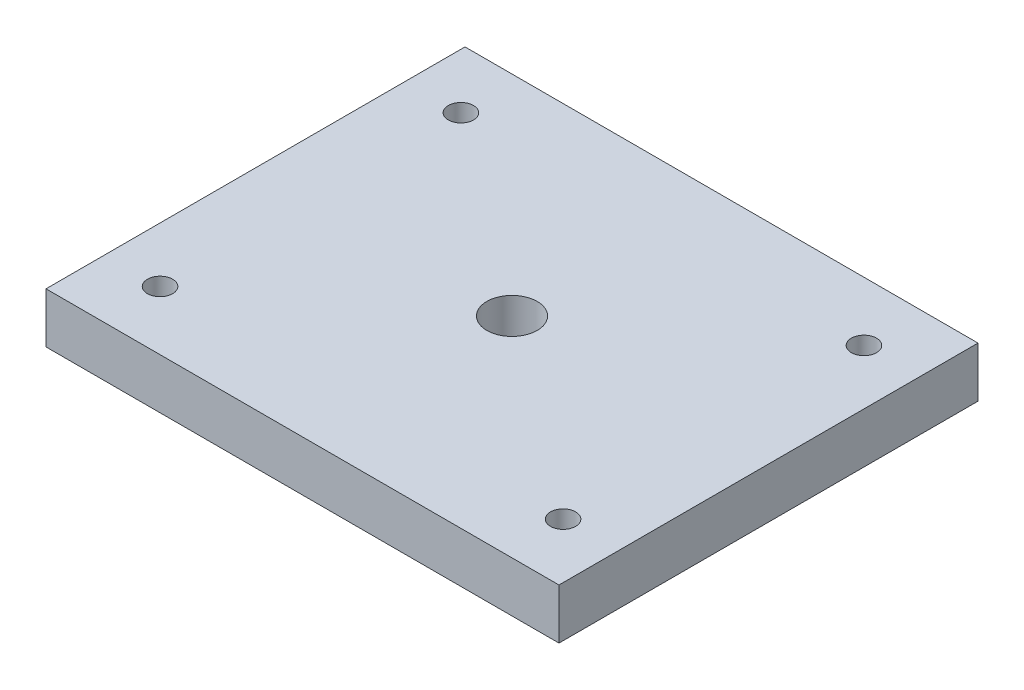
ISO-10303-21;
HEADER;
FILE_DESCRIPTION(('STEP AP214'),'2;1');
FILE_NAME('part.step','',(''),(''),'','','');
FILE_SCHEMA(('AUTOMOTIVE_DESIGN { 1 0 10303 214 1 1 1 1 }'));
ENDSEC;
DATA;
#1=APPLICATION_CONTEXT('core data for automotive mechanical design processes');
#2=APPLICATION_PROTOCOL_DEFINITION('international standard','automotive_design',2000,#1);
#3=PRODUCT_CONTEXT('',#1,'mechanical');
#4=PRODUCT('Part','Part','',(#3));
#5=PRODUCT_RELATED_PRODUCT_CATEGORY('part','',(#4));
#6=PRODUCT_DEFINITION_FORMATION('','',#4);
#7=PRODUCT_DEFINITION_CONTEXT('part definition',#1,'design');
#8=PRODUCT_DEFINITION('design','',#6,#7);
#9=PRODUCT_DEFINITION_SHAPE('','',#8);
#10=(LENGTH_UNIT() NAMED_UNIT(*) SI_UNIT(.MILLI.,.METRE.));
#11=(NAMED_UNIT(*) PLANE_ANGLE_UNIT() SI_UNIT($,.RADIAN.));
#12=(NAMED_UNIT(*) SI_UNIT($,.STERADIAN.) SOLID_ANGLE_UNIT());
#13=UNCERTAINTY_MEASURE_WITH_UNIT(LENGTH_MEASURE(1.E-05),#10,'distance_accuracy_value','');
#14=(GEOMETRIC_REPRESENTATION_CONTEXT(3) GLOBAL_UNCERTAINTY_ASSIGNED_CONTEXT((#13)) GLOBAL_UNIT_ASSIGNED_CONTEXT((#10,
#11,#12)) REPRESENTATION_CONTEXT('',''));
#15=CARTESIAN_POINT('',(0.,0.,0.));
#16=DIRECTION('',(0.,0.,1.));
#17=DIRECTION('',(1.,0.,0.));
#18=AXIS2_PLACEMENT_3D('',#15,#16,#17);
#19=CARTESIAN_POINT('',(6.35000000000009,11.2202211966208,0.));
#20=DIRECTION('',(0.,1.,0.));
#21=DIRECTION('',(0.,0.,1.));
#22=AXIS2_PLACEMENT_3D('',#19,#20,#21);
#23=PLANE('',#22);
#24=DIRECTION('',(0.,0.,1.));
#25=VECTOR('',#24,1.);
#26=CARTESIAN_POINT('',(-58.3485005648694,11.2202211966208,52.8472572907137));
#27=LINE('',#26,#25);
#28=CARTESIAN_POINT('',(-58.3485005648694,11.2202211966208,52.8472572907138));
#29=VERTEX_POINT('',#28);
#30=CARTESIAN_POINT('',(-58.3485005648694,11.2202211966208,-52.8472572907137));
#31=VERTEX_POINT('',#30);
#32=EDGE_CURVE('E67',#29,#31,#27,.F.);
#33=ORIENTED_EDGE('',*,*,#32,.F.);
#34=DIRECTION('',(1.,0.,0.));
#35=VECTOR('',#34,1.);
#36=CARTESIAN_POINT('',(71.0485005648693,11.2202211966208,52.8472572907138));
#37=LINE('',#36,#35);
#38=CARTESIAN_POINT('',(71.0485005648693,11.2202211966208,52.8472572907137));
#39=VERTEX_POINT('',#38);
#40=EDGE_CURVE('E58',#39,#29,#37,.F.);
#41=ORIENTED_EDGE('',*,*,#40,.F.);
#42=DIRECTION('',(0.,0.,-1.));
#43=VECTOR('',#42,1.);
#44=CARTESIAN_POINT('',(71.0485005648693,11.2202211966209,-52.8472572907137));
#45=LINE('',#44,#43);
#46=CARTESIAN_POINT('',(71.0485005648693,11.2202211966209,-52.8472572907137));
#47=VERTEX_POINT('',#46);
#48=EDGE_CURVE('E53',#47,#39,#45,.F.);
#49=ORIENTED_EDGE('',*,*,#48,.F.);
#50=DIRECTION('',(1.,0.,0.));
#51=VECTOR('',#50,1.);
#52=CARTESIAN_POINT('',(-58.3485005648694,11.2202211966208,-52.8472572907136));
#53=LINE('',#52,#51);
#54=EDGE_CURVE('E71',#31,#47,#53,.T.);
#55=ORIENTED_EDGE('',*,*,#54,.F.);
#56=EDGE_LOOP('',(#33,#41,#49,#55));
#57=FACE_BOUND('',#56,.T.);
#58=CARTESIAN_POINT('',(6.35,11.2202211966208,0.));
#59=DIRECTION('',(0.,1.,0.));
#60=DIRECTION('',(0.,0.,1.));
#61=AXIS2_PLACEMENT_3D('',#58,#59,#60);
#62=CIRCLE('',#61,6.35);
#63=CARTESIAN_POINT('',(6.35,11.2202211966208,6.35000000000005));
#64=VERTEX_POINT('',#63);
#65=EDGE_CURVE('E75',#64,#64,#62,.T.);
#66=ORIENTED_EDGE('',*,*,#65,.F.);
#67=EDGE_LOOP('',(#66));
#68=FACE_BOUND('',#67,.T.);
#69=CARTESIAN_POINT('',(-44.4811825663068,11.2202211966208,-37.9490403449471));
#70=DIRECTION('',(0.,-1.,0.));
#71=DIRECTION('',(0.,0.,-1.));
#72=AXIS2_PLACEMENT_3D('',#69,#70,#71);
#73=CIRCLE('',#72,3.175);
#74=CARTESIAN_POINT('',(-44.4811825663068,11.2202211966208,-41.1240403449471));
#75=VERTEX_POINT('',#74);
#76=EDGE_CURVE('E102',#75,#75,#73,.T.);
#77=ORIENTED_EDGE('',*,*,#76,.T.);
#78=EDGE_LOOP('',(#77));
#79=FACE_BOUND('',#78,.T.);
#80=CARTESIAN_POINT('',(57.181182566307,11.2202211966208,37.9490403449471));
#81=DIRECTION('',(0.,-1.,0.));
#82=DIRECTION('',(0.,0.,-1.));
#83=AXIS2_PLACEMENT_3D('',#80,#81,#82);
#84=CIRCLE('',#83,3.175);
#85=CARTESIAN_POINT('',(57.181182566307,11.2202211966208,34.7740403449471));
#86=VERTEX_POINT('',#85);
#87=EDGE_CURVE('E105',#86,#86,#84,.T.);
#88=ORIENTED_EDGE('',*,*,#87,.T.);
#89=EDGE_LOOP('',(#88));
#90=FACE_BOUND('',#89,.T.);
#91=CARTESIAN_POINT('',(57.181182566307,11.2202211966209,-37.9490403449471));
#92=DIRECTION('',(0.,-1.,0.));
#93=DIRECTION('',(0.,0.,-1.));
#94=AXIS2_PLACEMENT_3D('',#91,#92,#93);
#95=CIRCLE('',#94,3.175);
#96=CARTESIAN_POINT('',(57.181182566307,11.2202211966209,-41.1240403449471));
#97=VERTEX_POINT('',#96);
#98=EDGE_CURVE('E107',#97,#97,#95,.T.);
#99=ORIENTED_EDGE('',*,*,#98,.T.);
#100=EDGE_LOOP('',(#99));
#101=FACE_BOUND('',#100,.T.);
#102=CARTESIAN_POINT('',(-44.4811825663068,11.2202211966208,37.9490403449471));
#103=DIRECTION('',(0.,-1.,0.));
#104=DIRECTION('',(0.,0.,-1.));
#105=AXIS2_PLACEMENT_3D('',#102,#103,#104);
#106=CIRCLE('',#105,3.175);
#107=CARTESIAN_POINT('',(-44.4811825663068,11.2202211966208,34.7740403449471));
#108=VERTEX_POINT('',#107);
#109=EDGE_CURVE('E20',#108,#108,#106,.T.);
#110=ORIENTED_EDGE('',*,*,#109,.T.);
#111=EDGE_LOOP('',(#110));
#112=FACE_BOUND('',#111,.T.);
#113=ADVANCED_FACE('F17',(#57,#68,#79,#90,#101,#112),#23,.T.);
#114=CARTESIAN_POINT('',(-44.4811825663068,11.2202211966208,37.9490403449471));
#115=DIRECTION('',(0.,-1.,0.));
#116=DIRECTION('',(0.,0.,-1.));
#117=AXIS2_PLACEMENT_3D('',#114,#115,#116);
#118=CYLINDRICAL_SURFACE('',#117,3.175);
#119=CARTESIAN_POINT('',(-44.4811825663068,-1.47977880337922,37.9490403449471));
#120=DIRECTION('',(0.,-1.,0.));
#121=DIRECTION('',(0.,0.,-1.));
#122=AXIS2_PLACEMENT_3D('',#119,#120,#121);
#123=CIRCLE('',#122,3.175);
#124=CARTESIAN_POINT('',(-44.4811825663068,-1.47977880337921,34.7740403449471));
#125=VERTEX_POINT('',#124);
#126=EDGE_CURVE('E96',#125,#125,#123,.T.);
#127=ORIENTED_EDGE('',*,*,#126,.T.);
#128=EDGE_LOOP('',(#127));
#129=FACE_BOUND('',#128,.T.);
#130=ORIENTED_EDGE('',*,*,#109,.F.);
#131=EDGE_LOOP('',(#130));
#132=FACE_BOUND('',#131,.T.);
#133=ADVANCED_FACE('F115',(#129,#132),#118,.F.);
#134=CARTESIAN_POINT('',(57.181182566307,11.2202211966209,-37.9490403449471));
#135=DIRECTION('',(0.,-1.,0.));
#136=DIRECTION('',(0.,0.,-1.));
#137=AXIS2_PLACEMENT_3D('',#134,#135,#136);
#138=CYLINDRICAL_SURFACE('',#137,3.175);
#139=CARTESIAN_POINT('',(57.181182566307,-1.47977880337913,-37.9490403449471));
#140=DIRECTION('',(0.,-1.,0.));
#141=DIRECTION('',(0.,0.,-1.));
#142=AXIS2_PLACEMENT_3D('',#139,#140,#141);
#143=CIRCLE('',#142,3.175);
#144=CARTESIAN_POINT('',(57.181182566307,-1.47977880337913,-41.1240403449471));
#145=VERTEX_POINT('',#144);
#146=EDGE_CURVE('E93',#145,#145,#143,.T.);
#147=ORIENTED_EDGE('',*,*,#146,.T.);
#148=EDGE_LOOP('',(#147));
#149=FACE_BOUND('',#148,.T.);
#150=ORIENTED_EDGE('',*,*,#98,.F.);
#151=EDGE_LOOP('',(#150));
#152=FACE_BOUND('',#151,.T.);
#153=ADVANCED_FACE('F117',(#149,#152),#138,.F.);
#154=CARTESIAN_POINT('',(57.181182566307,11.2202211966208,37.9490403449471));
#155=DIRECTION('',(0.,-1.,0.));
#156=DIRECTION('',(0.,0.,-1.));
#157=AXIS2_PLACEMENT_3D('',#154,#155,#156);
#158=CYLINDRICAL_SURFACE('',#157,3.175);
#159=CARTESIAN_POINT('',(57.181182566307,-1.47977880337918,37.9490403449471));
#160=DIRECTION('',(0.,-1.,0.));
#161=DIRECTION('',(0.,0.,-1.));
#162=AXIS2_PLACEMENT_3D('',#159,#160,#161);
#163=CIRCLE('',#162,3.175);
#164=CARTESIAN_POINT('',(57.181182566307,-1.47977880337918,34.7740403449471));
#165=VERTEX_POINT('',#164);
#166=EDGE_CURVE('E90',#165,#165,#163,.T.);
#167=ORIENTED_EDGE('',*,*,#166,.T.);
#168=EDGE_LOOP('',(#167));
#169=FACE_BOUND('',#168,.T.);
#170=ORIENTED_EDGE('',*,*,#87,.F.);
#171=EDGE_LOOP('',(#170));
#172=FACE_BOUND('',#171,.T.);
#173=ADVANCED_FACE('F124',(#169,#172),#158,.F.);
#174=CARTESIAN_POINT('',(-44.4811825663068,11.2202211966208,-37.9490403449471));
#175=DIRECTION('',(0.,-1.,0.));
#176=DIRECTION('',(0.,0.,-1.));
#177=AXIS2_PLACEMENT_3D('',#174,#175,#176);
#178=CYLINDRICAL_SURFACE('',#177,3.175);
#179=CARTESIAN_POINT('',(-44.4811825663068,-1.47977880337917,-37.9490403449471));
#180=DIRECTION('',(0.,-1.,0.));
#181=DIRECTION('',(0.,0.,-1.));
#182=AXIS2_PLACEMENT_3D('',#179,#180,#181);
#183=CIRCLE('',#182,3.175);
#184=CARTESIAN_POINT('',(-44.4811825663068,-1.47977880337916,-41.1240403449471));
#185=VERTEX_POINT('',#184);
#186=EDGE_CURVE('E87',#185,#185,#183,.T.);
#187=ORIENTED_EDGE('',*,*,#186,.T.);
#188=EDGE_LOOP('',(#187));
#189=FACE_BOUND('',#188,.T.);
#190=ORIENTED_EDGE('',*,*,#76,.F.);
#191=EDGE_LOOP('',(#190));
#192=FACE_BOUND('',#191,.T.);
#193=ADVANCED_FACE('F149',(#189,#192),#178,.F.);
#194=CARTESIAN_POINT('',(6.35,-1.47977880337918,0.));
#195=DIRECTION('',(0.,1.,0.));
#196=DIRECTION('',(0.,0.,1.));
#197=AXIS2_PLACEMENT_3D('',#194,#195,#196);
#198=CYLINDRICAL_SURFACE('',#197,6.35);
#199=CARTESIAN_POINT('',(6.35,-1.47977880337918,0.));
#200=DIRECTION('',(0.,1.,0.));
#201=DIRECTION('',(0.,0.,1.));
#202=AXIS2_PLACEMENT_3D('',#199,#200,#201);
#203=CIRCLE('',#202,6.35);
#204=CARTESIAN_POINT('',(6.35,-1.47977880337918,6.35000000000004));
#205=VERTEX_POINT('',#204);
#206=EDGE_CURVE('E84',#205,#205,#203,.F.);
#207=ORIENTED_EDGE('',*,*,#206,.T.);
#208=EDGE_LOOP('',(#207));
#209=FACE_BOUND('',#208,.T.);
#210=ORIENTED_EDGE('',*,*,#65,.T.);
#211=EDGE_LOOP('',(#210));
#212=FACE_BOUND('',#211,.T.);
#213=ADVANCED_FACE('F146',(#209,#212),#198,.F.);
#214=CARTESIAN_POINT('',(-58.3485005648694,-1.47977880337923,52.8472572907137));
#215=DIRECTION('',(-1.,0.,0.));
#216=DIRECTION('',(0.,-1.,0.));
#217=AXIS2_PLACEMENT_3D('',#214,#215,#216);
#218=PLANE('',#217);
#219=DIRECTION('',(0.,0.,1.));
#220=VECTOR('',#219,1.);
#221=CARTESIAN_POINT('',(-58.3485005648694,-1.47977880337918,0.));
#222=LINE('',#221,#220);
#223=CARTESIAN_POINT('',(-58.3485005648694,-1.47977880337915,-52.8472572907137));
#224=VERTEX_POINT('',#223);
#225=CARTESIAN_POINT('',(-58.3485005648694,-1.47977880337919,52.8472572907137));
#226=VERTEX_POINT('',#225);
#227=EDGE_CURVE('E79',#224,#226,#222,.T.);
#228=ORIENTED_EDGE('',*,*,#227,.T.);
#229=DIRECTION('',(0.,-1.,0.));
#230=VECTOR('',#229,1.);
#231=CARTESIAN_POINT('',(-58.3485005648694,-1.47977880337919,52.8472572907137));
#232=LINE('',#231,#230);
#233=EDGE_CURVE('E63',#29,#226,#232,.T.);
#234=ORIENTED_EDGE('',*,*,#233,.F.);
#235=ORIENTED_EDGE('',*,*,#32,.T.);
#236=DIRECTION('',(0.,1.,0.));
#237=VECTOR('',#236,1.);
#238=CARTESIAN_POINT('',(-58.3485005648694,-1.47977880337916,-52.8472572907137));
#239=LINE('',#238,#237);
#240=EDGE_CURVE('E99',#224,#31,#239,.T.);
#241=ORIENTED_EDGE('',*,*,#240,.F.);
#242=EDGE_LOOP('',(#228,#234,#235,#241));
#243=FACE_BOUND('',#242,.T.);
#244=ADVANCED_FACE('F78',(#243),#218,.T.);
#245=CARTESIAN_POINT('',(71.0485005648693,-1.47977880337919,52.8472572907137));
#246=DIRECTION('',(0.,0.,1.));
#247=DIRECTION('',(0.,-1.,0.));
#248=AXIS2_PLACEMENT_3D('',#245,#246,#247);
#249=PLANE('',#248);
#250=DIRECTION('',(1.,0.,0.));
#251=VECTOR('',#250,1.);
#252=CARTESIAN_POINT('',(6.35000000000009,-1.47977880337921,52.8472572907137));
#253=LINE('',#252,#251);
#254=CARTESIAN_POINT('',(71.0485005648693,-1.47977880337922,52.8472572907137));
#255=VERTEX_POINT('',#254);
#256=EDGE_CURVE('E220',#226,#255,#253,.T.);
#257=ORIENTED_EDGE('',*,*,#256,.T.);
#258=DIRECTION('',(0.,1.,0.));
#259=VECTOR('',#258,1.);
#260=CARTESIAN_POINT('',(71.0485005648693,-1.47977880337912,52.8472572907137));
#261=LINE('',#260,#259);
#262=EDGE_CURVE('E65',#39,#255,#261,.F.);
#263=ORIENTED_EDGE('',*,*,#262,.F.);
#264=ORIENTED_EDGE('',*,*,#40,.T.);
#265=ORIENTED_EDGE('',*,*,#233,.T.);
#266=EDGE_LOOP('',(#257,#263,#264,#265));
#267=FACE_BOUND('',#266,.T.);
#268=ADVANCED_FACE('F61',(#267),#249,.T.);
#269=CARTESIAN_POINT('',(71.0485005648693,-1.47977880337912,-52.8472572907137));
#270=DIRECTION('',(1.,0.,0.));
#271=DIRECTION('',(0.,0.,-1.));
#272=AXIS2_PLACEMENT_3D('',#269,#270,#271);
#273=PLANE('',#272);
#274=DIRECTION('',(0.,0.,1.));
#275=VECTOR('',#274,1.);
#276=CARTESIAN_POINT('',(71.0485005648693,-1.47977880337918,0.));
#277=LINE('',#276,#275);
#278=CARTESIAN_POINT('',(71.0485005648693,-1.47977880337916,-52.8472572907137));
#279=VERTEX_POINT('',#278);
#280=EDGE_CURVE('E26',#255,#279,#277,.F.);
#281=ORIENTED_EDGE('',*,*,#280,.T.);
#282=DIRECTION('',(0.,1.,0.));
#283=VECTOR('',#282,1.);
#284=CARTESIAN_POINT('',(71.0485005648693,-1.47977880337916,-52.8472572907137));
#285=LINE('',#284,#283);
#286=EDGE_CURVE('E34',#47,#279,#285,.F.);
#287=ORIENTED_EDGE('',*,*,#286,.F.);
#288=ORIENTED_EDGE('',*,*,#48,.T.);
#289=ORIENTED_EDGE('',*,*,#262,.T.);
#290=EDGE_LOOP('',(#281,#287,#288,#289));
#291=FACE_BOUND('',#290,.T.);
#292=ADVANCED_FACE('F135',(#291),#273,.T.);
#293=CARTESIAN_POINT('',(-58.3485005648694,-1.47977880337916,-52.8472572907137));
#294=DIRECTION('',(0.,0.,-1.));
#295=DIRECTION('',(0.,1.,0.));
#296=AXIS2_PLACEMENT_3D('',#293,#294,#295);
#297=PLANE('',#296);
#298=DIRECTION('',(1.,0.,0.));
#299=VECTOR('',#298,1.);
#300=CARTESIAN_POINT('',(6.35000000000009,-1.47977880337914,-52.8472572907137));
#301=LINE('',#300,#299);
#302=EDGE_CURVE('E11',#279,#224,#301,.F.);
#303=ORIENTED_EDGE('',*,*,#302,.T.);
#304=ORIENTED_EDGE('',*,*,#240,.T.);
#305=ORIENTED_EDGE('',*,*,#54,.T.);
#306=ORIENTED_EDGE('',*,*,#286,.T.);
#307=EDGE_LOOP('',(#303,#304,#305,#306));
#308=FACE_BOUND('',#307,.T.);
#309=ADVANCED_FACE('F129',(#308),#297,.T.);
#310=CARTESIAN_POINT('',(6.35000000000009,-1.47977880337918,0.));
#311=DIRECTION('',(0.,1.,0.));
#312=DIRECTION('',(0.,0.,1.));
#313=AXIS2_PLACEMENT_3D('',#310,#311,#312);
#314=PLANE('',#313);
#315=ORIENTED_EDGE('',*,*,#280,.F.);
#316=ORIENTED_EDGE('',*,*,#256,.F.);
#317=ORIENTED_EDGE('',*,*,#227,.F.);
#318=ORIENTED_EDGE('',*,*,#302,.F.);
#319=EDGE_LOOP('',(#315,#316,#317,#318));
#320=FACE_BOUND('',#319,.T.);
#321=ORIENTED_EDGE('',*,*,#206,.F.);
#322=EDGE_LOOP('',(#321));
#323=FACE_BOUND('',#322,.T.);
#324=ORIENTED_EDGE('',*,*,#186,.F.);
#325=EDGE_LOOP('',(#324));
#326=FACE_BOUND('',#325,.T.);
#327=ORIENTED_EDGE('',*,*,#166,.F.);
#328=EDGE_LOOP('',(#327));
#329=FACE_BOUND('',#328,.T.);
#330=ORIENTED_EDGE('',*,*,#146,.F.);
#331=EDGE_LOOP('',(#330));
#332=FACE_BOUND('',#331,.T.);
#333=ORIENTED_EDGE('',*,*,#126,.F.);
#334=EDGE_LOOP('',(#333));
#335=FACE_BOUND('',#334,.T.);
#336=ADVANCED_FACE('F127',(#320,#323,#326,#329,#332,#335),#314,.F.);
#337=CLOSED_SHELL('',(#113,#133,#153,#173,#193,#213,#244,#268,#292,#309,#336));
#338=MANIFOLD_SOLID_BREP('B1',#337);
#339=ADVANCED_BREP_SHAPE_REPRESENTATION('',(#18,#338),#14);
#340=SHAPE_DEFINITION_REPRESENTATION(#9,#339);
ENDSEC;
END-ISO-10303-21;
